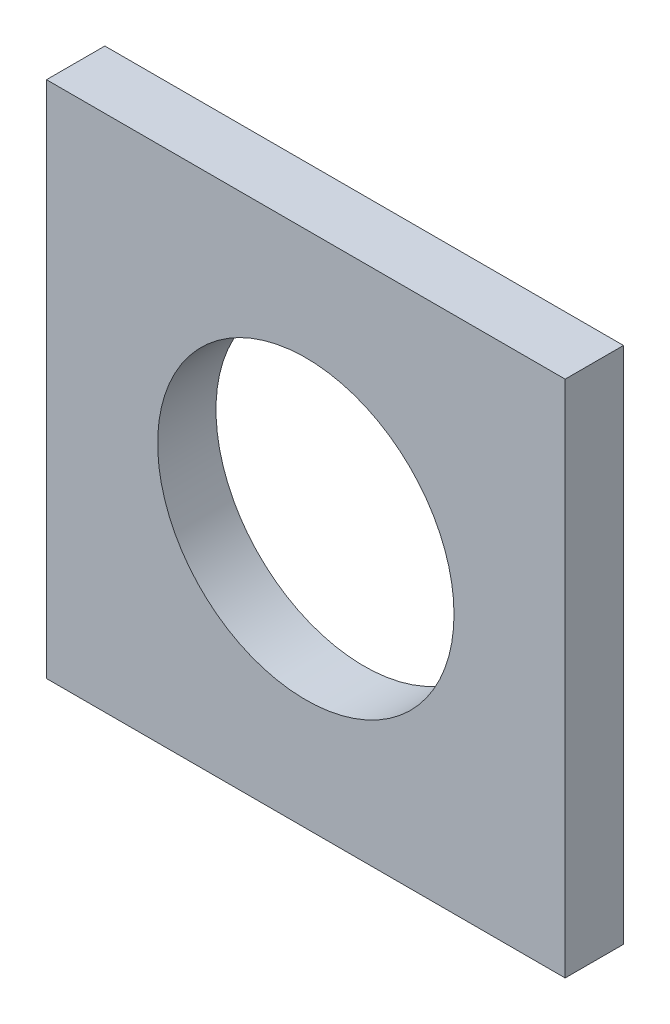
ISO-10303-21;
HEADER;
FILE_DESCRIPTION(('STEP AP214'),'2;1');
FILE_NAME('part.step','',(''),(''),'','','');
FILE_SCHEMA(('AUTOMOTIVE_DESIGN { 1 0 10303 214 1 1 1 1 }'));
ENDSEC;
DATA;
#1=APPLICATION_CONTEXT('core data for automotive mechanical design processes');
#2=APPLICATION_PROTOCOL_DEFINITION('international standard','automotive_design',2000,#1);
#3=PRODUCT_CONTEXT('',#1,'mechanical');
#4=PRODUCT('Part','Part','',(#3));
#5=PRODUCT_RELATED_PRODUCT_CATEGORY('part','',(#4));
#6=PRODUCT_DEFINITION_FORMATION('','',#4);
#7=PRODUCT_DEFINITION_CONTEXT('part definition',#1,'design');
#8=PRODUCT_DEFINITION('design','',#6,#7);
#9=PRODUCT_DEFINITION_SHAPE('','',#8);
#10=(LENGTH_UNIT() NAMED_UNIT(*) SI_UNIT(.MILLI.,.METRE.));
#11=(NAMED_UNIT(*) PLANE_ANGLE_UNIT() SI_UNIT($,.RADIAN.));
#12=(NAMED_UNIT(*) SI_UNIT($,.STERADIAN.) SOLID_ANGLE_UNIT());
#13=UNCERTAINTY_MEASURE_WITH_UNIT(LENGTH_MEASURE(1.E-05),#10,'distance_accuracy_value','');
#14=(GEOMETRIC_REPRESENTATION_CONTEXT(3) GLOBAL_UNCERTAINTY_ASSIGNED_CONTEXT((#13)) GLOBAL_UNIT_ASSIGNED_CONTEXT((#10,
#11,#12)) REPRESENTATION_CONTEXT('',''));
#15=CARTESIAN_POINT('',(0.,0.,0.));
#16=DIRECTION('',(0.,0.,1.));
#17=DIRECTION('',(1.,0.,0.));
#18=AXIS2_PLACEMENT_3D('',#15,#16,#17);
#19=CARTESIAN_POINT('',(153.669998168945,74.9300003051758,0.));
#20=DIRECTION('',(0.,-1.,0.));
#21=DIRECTION('',(-1.,0.,0.));
#22=AXIS2_PLACEMENT_3D('',#19,#20,#21);
#23=PLANE('',#22);
#24=DIRECTION('',(-1.,0.,0.));
#25=VECTOR('',#24,1.);
#26=CARTESIAN_POINT('',(153.669998168945,74.9300003051758,0.1999996));
#27=LINE('',#26,#25);
#28=CARTESIAN_POINT('',(153.669998168945,74.9300003051758,0.1999996));
#29=VERTEX_POINT('',#28);
#30=CARTESIAN_POINT('',(151.891998291016,74.9300003051758,0.1999996));
#31=VERTEX_POINT('',#30);
#32=EDGE_CURVE('E11',#29,#31,#27,.T.);
#33=ORIENTED_EDGE('',*,*,#32,.F.);
#34=DIRECTION('',(0.,0.,1.));
#35=VECTOR('',#34,1.);
#36=CARTESIAN_POINT('',(153.669998168945,74.9300003051758,0.));
#37=LINE('',#36,#35);
#38=CARTESIAN_POINT('',(153.669998168945,74.9300003051758,0.));
#39=VERTEX_POINT('',#38);
#40=EDGE_CURVE('E24',#39,#29,#37,.T.);
#41=ORIENTED_EDGE('',*,*,#40,.F.);
#42=DIRECTION('',(-1.,0.,0.));
#43=VECTOR('',#42,1.);
#44=CARTESIAN_POINT('',(153.669998168945,74.9300003051758,0.));
#45=LINE('',#44,#43);
#46=CARTESIAN_POINT('',(151.891998291016,74.9300003051758,0.));
#47=VERTEX_POINT('',#46);
#48=EDGE_CURVE('E96',#39,#47,#45,.T.);
#49=ORIENTED_EDGE('',*,*,#48,.T.);
#50=DIRECTION('',(0.,0.,1.));
#51=VECTOR('',#50,1.);
#52=CARTESIAN_POINT('',(151.891998291016,74.9300003051758,0.));
#53=LINE('',#52,#51);
#54=EDGE_CURVE('E37',#47,#31,#53,.T.);
#55=ORIENTED_EDGE('',*,*,#54,.T.);
#56=EDGE_LOOP('',(#33,#41,#49,#55));
#57=FACE_BOUND('',#56,.T.);
#58=ADVANCED_FACE('F17',(#57),#23,.F.);
#59=CARTESIAN_POINT('',(151.891998291016,74.9300003051758,0.));
#60=DIRECTION('',(1.,0.,0.));
#61=DIRECTION('',(0.,-1.,0.));
#62=AXIS2_PLACEMENT_3D('',#59,#60,#61);
#63=PLANE('',#62);
#64=DIRECTION('',(0.,-1.,0.));
#65=VECTOR('',#64,1.);
#66=CARTESIAN_POINT('',(151.891998291016,74.9300003051758,0.1999996));
#67=LINE('',#66,#65);
#68=CARTESIAN_POINT('',(151.891998291016,73.1520004272461,0.1999996));
#69=VERTEX_POINT('',#68);
#70=EDGE_CURVE('E92',#31,#69,#67,.T.);
#71=ORIENTED_EDGE('',*,*,#70,.F.);
#72=ORIENTED_EDGE('',*,*,#54,.F.);
#73=DIRECTION('',(0.,-1.,0.));
#74=VECTOR('',#73,1.);
#75=CARTESIAN_POINT('',(151.891998291016,74.9300003051758,0.));
#76=LINE('',#75,#74);
#77=CARTESIAN_POINT('',(151.891998291016,73.1520004272461,0.));
#78=VERTEX_POINT('',#77);
#79=EDGE_CURVE('E89',#47,#78,#76,.T.);
#80=ORIENTED_EDGE('',*,*,#79,.T.);
#81=DIRECTION('',(0.,0.,1.));
#82=VECTOR('',#81,1.);
#83=CARTESIAN_POINT('',(151.891998291016,73.1520004272461,0.));
#84=LINE('',#83,#82);
#85=EDGE_CURVE('E87',#78,#69,#84,.T.);
#86=ORIENTED_EDGE('',*,*,#85,.T.);
#87=EDGE_LOOP('',(#71,#72,#80,#86));
#88=FACE_BOUND('',#87,.T.);
#89=ADVANCED_FACE('F104',(#88),#63,.F.);
#90=CARTESIAN_POINT('',(151.891998291016,73.1520004272461,0.));
#91=DIRECTION('',(0.,1.,0.));
#92=DIRECTION('',(1.,0.,0.));
#93=AXIS2_PLACEMENT_3D('',#90,#91,#92);
#94=PLANE('',#93);
#95=DIRECTION('',(1.,0.,0.));
#96=VECTOR('',#95,1.);
#97=CARTESIAN_POINT('',(151.891998291016,73.1520004272461,0.1999996));
#98=LINE('',#97,#96);
#99=CARTESIAN_POINT('',(153.669998168945,73.1520004272461,0.1999996));
#100=VERTEX_POINT('',#99);
#101=EDGE_CURVE('E84',#69,#100,#98,.T.);
#102=ORIENTED_EDGE('',*,*,#101,.F.);
#103=ORIENTED_EDGE('',*,*,#85,.F.);
#104=DIRECTION('',(1.,0.,0.));
#105=VECTOR('',#104,1.);
#106=CARTESIAN_POINT('',(151.891998291016,73.1520004272461,0.));
#107=LINE('',#106,#105);
#108=CARTESIAN_POINT('',(153.669998168945,73.1520004272461,0.));
#109=VERTEX_POINT('',#108);
#110=EDGE_CURVE('E81',#78,#109,#107,.T.);
#111=ORIENTED_EDGE('',*,*,#110,.T.);
#112=DIRECTION('',(0.,0.,1.));
#113=VECTOR('',#112,1.);
#114=CARTESIAN_POINT('',(153.669998168945,73.1520004272461,0.));
#115=LINE('',#114,#113);
#116=EDGE_CURVE('E79',#109,#100,#115,.T.);
#117=ORIENTED_EDGE('',*,*,#116,.T.);
#118=EDGE_LOOP('',(#102,#103,#111,#117));
#119=FACE_BOUND('',#118,.T.);
#120=ADVANCED_FACE('F110',(#119),#94,.F.);
#121=CARTESIAN_POINT('',(153.669998168945,73.1520004272461,0.));
#122=DIRECTION('',(-1.,0.,0.));
#123=DIRECTION('',(0.,1.,0.));
#124=AXIS2_PLACEMENT_3D('',#121,#122,#123);
#125=PLANE('',#124);
#126=DIRECTION('',(0.,1.,0.));
#127=VECTOR('',#126,1.);
#128=CARTESIAN_POINT('',(153.669998168945,73.1520004272461,0.1999996));
#129=LINE('',#128,#127);
#130=EDGE_CURVE('E76',#100,#29,#129,.T.);
#131=ORIENTED_EDGE('',*,*,#130,.F.);
#132=ORIENTED_EDGE('',*,*,#116,.F.);
#133=DIRECTION('',(0.,1.,0.));
#134=VECTOR('',#133,1.);
#135=CARTESIAN_POINT('',(153.669998168945,73.1520004272461,0.));
#136=LINE('',#135,#134);
#137=EDGE_CURVE('E68',#109,#39,#136,.T.);
#138=ORIENTED_EDGE('',*,*,#137,.T.);
#139=ORIENTED_EDGE('',*,*,#40,.T.);
#140=EDGE_LOOP('',(#131,#132,#138,#139));
#141=FACE_BOUND('',#140,.T.);
#142=ADVANCED_FACE('F111',(#141),#125,.F.);
#143=CARTESIAN_POINT('',(152.781,74.041,0.));
#144=DIRECTION('',(0.,0.,-1.));
#145=DIRECTION('',(1.,0.,0.));
#146=AXIS2_PLACEMENT_3D('',#143,#144,#145);
#147=CYLINDRICAL_SURFACE('',#146,0.508);
#148=DIRECTION('',(0.,0.,1.));
#149=VECTOR('',#148,1.);
#150=CARTESIAN_POINT('',(153.289,74.041,0.));
#151=LINE('',#150,#149);
#152=CARTESIAN_POINT('',(153.289,74.041,0.));
#153=VERTEX_POINT('',#152);
#154=CARTESIAN_POINT('',(153.289,74.041,0.1999996));
#155=VERTEX_POINT('',#154);
#156=EDGE_CURVE('E62',#153,#155,#151,.T.);
#157=ORIENTED_EDGE('',*,*,#156,.T.);
#158=CARTESIAN_POINT('',(152.781,74.041,0.1999996));
#159=DIRECTION('',(0.,0.,1.));
#160=DIRECTION('',(1.,0.,0.));
#161=AXIS2_PLACEMENT_3D('',#158,#159,#160);
#162=CIRCLE('',#161,0.508);
#163=EDGE_CURVE('E67',#155,#155,#162,.T.);
#164=ORIENTED_EDGE('',*,*,#163,.T.);
#165=ORIENTED_EDGE('',*,*,#156,.F.);
#166=CARTESIAN_POINT('',(152.781,74.041,0.));
#167=DIRECTION('',(0.,0.,1.));
#168=DIRECTION('',(1.,0.,0.));
#169=AXIS2_PLACEMENT_3D('',#166,#167,#168);
#170=CIRCLE('',#169,0.508);
#171=EDGE_CURVE('E65',#153,#153,#170,.T.);
#172=ORIENTED_EDGE('',*,*,#171,.F.);
#173=EDGE_LOOP('',(#157,#164,#165,#172));
#174=FACE_BOUND('',#173,.T.);
#175=ADVANCED_FACE('F64',(#174),#147,.F.);
#176=CARTESIAN_POINT('',(153.669998168945,74.9300003051758,0.));
#177=DIRECTION('',(0.,0.,-1.));
#178=DIRECTION('',(-1.,0.,0.));
#179=AXIS2_PLACEMENT_3D('',#176,#177,#178);
#180=PLANE('',#179);
#181=ORIENTED_EDGE('',*,*,#137,.F.);
#182=ORIENTED_EDGE('',*,*,#110,.F.);
#183=ORIENTED_EDGE('',*,*,#79,.F.);
#184=ORIENTED_EDGE('',*,*,#48,.F.);
#185=EDGE_LOOP('',(#181,#182,#183,#184));
#186=FACE_BOUND('',#185,.T.);
#187=ORIENTED_EDGE('',*,*,#171,.T.);
#188=EDGE_LOOP('',(#187));
#189=FACE_BOUND('',#188,.T.);
#190=ADVANCED_FACE('F71',(#186,#189),#180,.T.);
#191=CARTESIAN_POINT('',(153.669998168945,74.9300003051758,0.1999996));
#192=DIRECTION('',(0.,0.,-1.));
#193=DIRECTION('',(-1.,0.,0.));
#194=AXIS2_PLACEMENT_3D('',#191,#192,#193);
#195=PLANE('',#194);
#196=ORIENTED_EDGE('',*,*,#32,.T.);
#197=ORIENTED_EDGE('',*,*,#70,.T.);
#198=ORIENTED_EDGE('',*,*,#101,.T.);
#199=ORIENTED_EDGE('',*,*,#130,.T.);
#200=EDGE_LOOP('',(#196,#197,#198,#199));
#201=FACE_BOUND('',#200,.T.);
#202=ORIENTED_EDGE('',*,*,#163,.F.);
#203=EDGE_LOOP('',(#202));
#204=FACE_BOUND('',#203,.T.);
#205=ADVANCED_FACE('F107',(#201,#204),#195,.F.);
#206=CLOSED_SHELL('',(#58,#89,#120,#142,#175,#190,#205));
#207=MANIFOLD_SOLID_BREP('B1',#206);
#208=ADVANCED_BREP_SHAPE_REPRESENTATION('',(#18,#207),#14);
#209=SHAPE_DEFINITION_REPRESENTATION(#9,#208);
ENDSEC;
END-ISO-10303-21;
